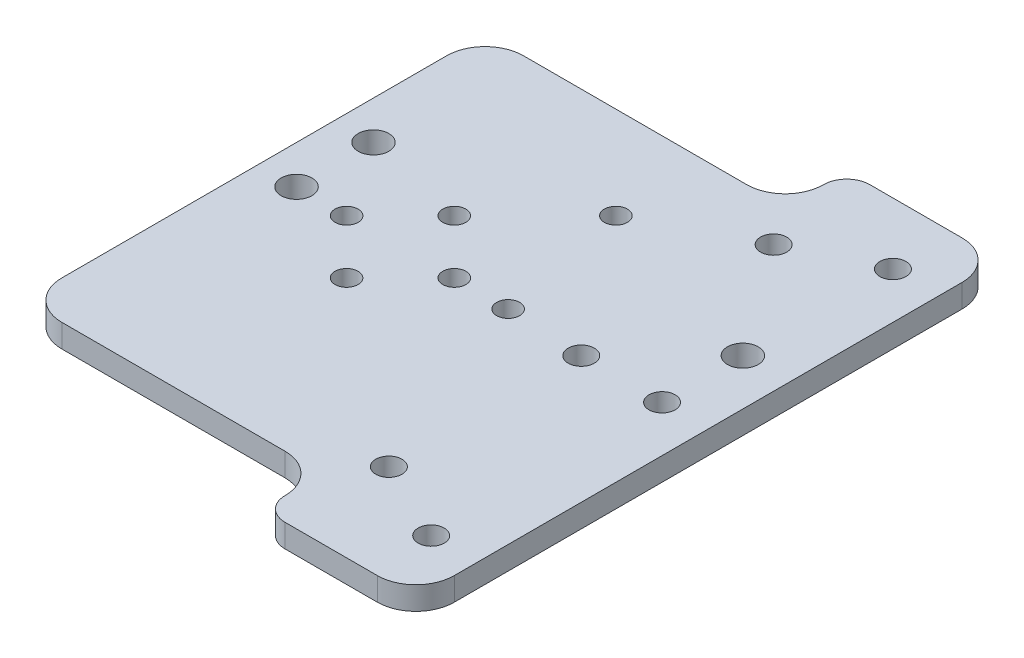
ISO-10303-21;
HEADER;
FILE_DESCRIPTION(('STEP AP214'),'2;1');
FILE_NAME('part.step','',(''),(''),'','','');
FILE_SCHEMA(('AUTOMOTIVE_DESIGN { 1 0 10303 214 1 1 1 1 }'));
ENDSEC;
DATA;
#1=APPLICATION_CONTEXT('core data for automotive mechanical design processes');
#2=APPLICATION_PROTOCOL_DEFINITION('international standard','automotive_design',2000,#1);
#3=PRODUCT_CONTEXT('',#1,'mechanical');
#4=PRODUCT('Part','Part','',(#3));
#5=PRODUCT_RELATED_PRODUCT_CATEGORY('part','',(#4));
#6=PRODUCT_DEFINITION_FORMATION('','',#4);
#7=PRODUCT_DEFINITION_CONTEXT('part definition',#1,'design');
#8=PRODUCT_DEFINITION('design','',#6,#7);
#9=PRODUCT_DEFINITION_SHAPE('','',#8);
#10=(LENGTH_UNIT() NAMED_UNIT(*) SI_UNIT(.MILLI.,.METRE.));
#11=(NAMED_UNIT(*) PLANE_ANGLE_UNIT() SI_UNIT($,.RADIAN.));
#12=(NAMED_UNIT(*) SI_UNIT($,.STERADIAN.) SOLID_ANGLE_UNIT());
#13=UNCERTAINTY_MEASURE_WITH_UNIT(LENGTH_MEASURE(1.E-05),#10,'distance_accuracy_value','');
#14=(GEOMETRIC_REPRESENTATION_CONTEXT(3) GLOBAL_UNCERTAINTY_ASSIGNED_CONTEXT((#13)) GLOBAL_UNIT_ASSIGNED_CONTEXT((#10,
#11,#12)) REPRESENTATION_CONTEXT('',''));
#15=CARTESIAN_POINT('',(0.,0.,0.));
#16=DIRECTION('',(0.,0.,1.));
#17=DIRECTION('',(1.,0.,0.));
#18=AXIS2_PLACEMENT_3D('',#15,#16,#17);
#19=CARTESIAN_POINT('',(0.,3.,0.));
#20=DIRECTION('',(0.,-1.,0.));
#21=DIRECTION('',(0.,0.,-1.));
#22=AXIS2_PLACEMENT_3D('',#19,#20,#21);
#23=PLANE('',#22);
#24=CARTESIAN_POINT('',(32.5,3.,-0.499999999999969));
#25=DIRECTION('',(0.,1.,0.));
#26=DIRECTION('',(0.,0.,1.));
#27=AXIS2_PLACEMENT_3D('',#24,#25,#26);
#28=CIRCLE('',#27,1.5);
#29=CARTESIAN_POINT('',(32.5,3.,1.00000000000004));
#30=VERTEX_POINT('',#29);
#31=EDGE_CURVE('E620',#30,#30,#28,.T.);
#32=ORIENTED_EDGE('',*,*,#31,.F.);
#33=EDGE_LOOP('',(#32));
#34=FACE_BOUND('',#33,.T.);
#35=CARTESIAN_POINT('',(53.,3.,30.));
#36=DIRECTION('',(0.,1.,0.));
#37=DIRECTION('',(0.,0.,1.));
#38=AXIS2_PLACEMENT_3D('',#35,#36,#37);
#39=CIRCLE('',#38,1.7);
#40=CARTESIAN_POINT('',(53.,3.,31.7));
#41=VERTEX_POINT('',#40);
#42=EDGE_CURVE('E636',#41,#41,#39,.T.);
#43=ORIENTED_EDGE('',*,*,#42,.F.);
#44=EDGE_LOOP('',(#43));
#45=FACE_BOUND('',#44,.T.);
#46=CARTESIAN_POINT('',(53.,3.,0.));
#47=DIRECTION('',(0.,1.,0.));
#48=DIRECTION('',(0.,0.,1.));
#49=AXIS2_PLACEMENT_3D('',#46,#47,#48);
#50=CIRCLE('',#49,1.7);
#51=CARTESIAN_POINT('',(53.,3.,1.7));
#52=VERTEX_POINT('',#51);
#53=EDGE_CURVE('E641',#52,#52,#50,.T.);
#54=ORIENTED_EDGE('',*,*,#53,.F.);
#55=EDGE_LOOP('',(#54));
#56=FACE_BOUND('',#55,.T.);
#57=CARTESIAN_POINT('',(53.,3.,-30.));
#58=DIRECTION('',(0.,1.,0.));
#59=DIRECTION('',(0.,0.,1.));
#60=AXIS2_PLACEMENT_3D('',#57,#58,#59);
#61=CIRCLE('',#60,1.7);
#62=CARTESIAN_POINT('',(53.,3.,-28.3));
#63=VERTEX_POINT('',#62);
#64=EDGE_CURVE('E591',#63,#63,#61,.T.);
#65=ORIENTED_EDGE('',*,*,#64,.F.);
#66=EDGE_LOOP('',(#65));
#67=FACE_BOUND('',#66,.T.);
#68=CARTESIAN_POINT('',(42.5,3.,0.));
#69=DIRECTION('',(0.,1.,0.));
#70=DIRECTION('',(0.,0.,1.));
#71=AXIS2_PLACEMENT_3D('',#68,#69,#70);
#72=CIRCLE('',#71,1.7);
#73=CARTESIAN_POINT('',(42.5,3.,1.7));
#74=VERTEX_POINT('',#73);
#75=EDGE_CURVE('E586',#74,#74,#72,.T.);
#76=ORIENTED_EDGE('',*,*,#75,.F.);
#77=EDGE_LOOP('',(#76));
#78=FACE_BOUND('',#77,.T.);
#79=CARTESIAN_POINT('',(42.5,3.,-25.));
#80=DIRECTION('',(0.,1.,0.));
#81=DIRECTION('',(0.,0.,1.));
#82=AXIS2_PLACEMENT_3D('',#79,#80,#81);
#83=CIRCLE('',#82,1.69999999999999);
#84=CARTESIAN_POINT('',(42.5,3.,-23.3));
#85=VERTEX_POINT('',#84);
#86=EDGE_CURVE('E311',#85,#85,#83,.T.);
#87=ORIENTED_EDGE('',*,*,#86,.F.);
#88=EDGE_LOOP('',(#87));
#89=FACE_BOUND('',#88,.T.);
#90=CARTESIAN_POINT('',(42.5,3.,25.));
#91=DIRECTION('',(0.,1.,0.));
#92=DIRECTION('',(0.,0.,1.));
#93=AXIS2_PLACEMENT_3D('',#90,#91,#92);
#94=CIRCLE('',#93,1.69999999999999);
#95=CARTESIAN_POINT('',(42.5,3.,26.7));
#96=VERTEX_POINT('',#95);
#97=EDGE_CURVE('E253',#96,#96,#94,.T.);
#98=ORIENTED_EDGE('',*,*,#97,.F.);
#99=EDGE_LOOP('',(#98));
#100=FACE_BOUND('',#99,.T.);
#101=CARTESIAN_POINT('',(34.,3.,35.));
#102=DIRECTION('',(0.,-1.,0.));
#103=DIRECTION('',(0.,0.,-1.));
#104=AXIS2_PLACEMENT_3D('',#101,#102,#103);
#105=CIRCLE('',#104,5.);
#106=CARTESIAN_POINT('',(34.,3.,30.));
#107=VERTEX_POINT('',#106);
#108=CARTESIAN_POINT('',(39.,3.,35.));
#109=VERTEX_POINT('',#108);
#110=EDGE_CURVE('E217',#107,#109,#105,.T.);
#111=ORIENTED_EDGE('',*,*,#110,.T.);
#112=CARTESIAN_POINT('',(42.,3.,35.));
#113=DIRECTION('',(0.,-1.,0.));
#114=DIRECTION('',(0.,0.,-1.));
#115=AXIS2_PLACEMENT_3D('',#112,#113,#114);
#116=CIRCLE('',#115,3.);
#117=CARTESIAN_POINT('',(42.,3.,38.));
#118=VERTEX_POINT('',#117);
#119=EDGE_CURVE('E42',#109,#118,#116,.F.);
#120=ORIENTED_EDGE('',*,*,#119,.T.);
#121=DIRECTION('',(1.,0.,0.));
#122=VECTOR('',#121,1.);
#123=CARTESIAN_POINT('',(59.,3.,38.));
#124=LINE('',#123,#122);
#125=CARTESIAN_POINT('',(54.,3.,38.));
#126=VERTEX_POINT('',#125);
#127=EDGE_CURVE('E172',#118,#126,#124,.T.);
#128=ORIENTED_EDGE('',*,*,#127,.T.);
#129=CARTESIAN_POINT('',(54.,3.,33.));
#130=DIRECTION('',(0.,-1.,0.));
#131=DIRECTION('',(0.,0.,-1.));
#132=AXIS2_PLACEMENT_3D('',#129,#130,#131);
#133=CIRCLE('',#132,5.);
#134=CARTESIAN_POINT('',(59.,3.,33.));
#135=VERTEX_POINT('',#134);
#136=EDGE_CURVE('E184',#126,#135,#133,.F.);
#137=ORIENTED_EDGE('',*,*,#136,.T.);
#138=DIRECTION('',(0.,0.,-1.));
#139=VECTOR('',#138,1.);
#140=CARTESIAN_POINT('',(59.,3.,-38.));
#141=LINE('',#140,#139);
#142=CARTESIAN_POINT('',(59.,3.,-33.));
#143=VERTEX_POINT('',#142);
#144=EDGE_CURVE('E166',#135,#143,#141,.T.);
#145=ORIENTED_EDGE('',*,*,#144,.T.);
#146=CARTESIAN_POINT('',(54.,3.,-33.));
#147=DIRECTION('',(0.,-1.,0.));
#148=DIRECTION('',(0.,0.,-1.));
#149=AXIS2_PLACEMENT_3D('',#146,#147,#148);
#150=CIRCLE('',#149,5.);
#151=CARTESIAN_POINT('',(54.,3.,-38.));
#152=VERTEX_POINT('',#151);
#153=EDGE_CURVE('E182',#143,#152,#150,.F.);
#154=ORIENTED_EDGE('',*,*,#153,.T.);
#155=DIRECTION('',(-1.,0.,0.));
#156=VECTOR('',#155,1.);
#157=CARTESIAN_POINT('',(39.,3.,-38.));
#158=LINE('',#157,#156);
#159=CARTESIAN_POINT('',(42.,3.,-38.));
#160=VERTEX_POINT('',#159);
#161=EDGE_CURVE('E321',#152,#160,#158,.T.);
#162=ORIENTED_EDGE('',*,*,#161,.T.);
#163=CARTESIAN_POINT('',(42.,3.,-35.));
#164=DIRECTION('',(0.,-1.,0.));
#165=DIRECTION('',(0.,0.,-1.));
#166=AXIS2_PLACEMENT_3D('',#163,#164,#165);
#167=CIRCLE('',#166,3.);
#168=CARTESIAN_POINT('',(39.,3.,-35.));
#169=VERTEX_POINT('',#168);
#170=EDGE_CURVE('E225',#160,#169,#167,.F.);
#171=ORIENTED_EDGE('',*,*,#170,.T.);
#172=CARTESIAN_POINT('',(34.,3.,-35.));
#173=DIRECTION('',(0.,-1.,0.));
#174=DIRECTION('',(0.,0.,-1.));
#175=AXIS2_PLACEMENT_3D('',#172,#173,#174);
#176=CIRCLE('',#175,5.);
#177=CARTESIAN_POINT('',(34.,3.,-30.));
#178=VERTEX_POINT('',#177);
#179=EDGE_CURVE('E214',#169,#178,#176,.T.);
#180=ORIENTED_EDGE('',*,*,#179,.T.);
#181=DIRECTION('',(-1.,0.,0.));
#182=VECTOR('',#181,1.);
#183=CARTESIAN_POINT('',(0.,3.,-30.));
#184=LINE('',#183,#182);
#185=CARTESIAN_POINT('',(5.,3.,-30.));
#186=VERTEX_POINT('',#185);
#187=EDGE_CURVE('E245',#178,#186,#184,.T.);
#188=ORIENTED_EDGE('',*,*,#187,.T.);
#189=CARTESIAN_POINT('',(5.,3.,-25.));
#190=DIRECTION('',(0.,-1.,0.));
#191=DIRECTION('',(0.,0.,-1.));
#192=AXIS2_PLACEMENT_3D('',#189,#190,#191);
#193=CIRCLE('',#192,5.);
#194=CARTESIAN_POINT('',(0.,3.,-25.));
#195=VERTEX_POINT('',#194);
#196=EDGE_CURVE('E186',#186,#195,#193,.F.);
#197=ORIENTED_EDGE('',*,*,#196,.T.);
#198=DIRECTION('',(0.,0.,1.));
#199=VECTOR('',#198,1.);
#200=CARTESIAN_POINT('',(0.,3.,0.));
#201=LINE('',#200,#199);
#202=CARTESIAN_POINT('',(0.,3.,25.));
#203=VERTEX_POINT('',#202);
#204=EDGE_CURVE('E243',#195,#203,#201,.T.);
#205=ORIENTED_EDGE('',*,*,#204,.T.);
#206=CARTESIAN_POINT('',(5.,3.,25.));
#207=DIRECTION('',(0.,-1.,0.));
#208=DIRECTION('',(0.,0.,-1.));
#209=AXIS2_PLACEMENT_3D('',#206,#207,#208);
#210=CIRCLE('',#209,5.);
#211=CARTESIAN_POINT('',(5.,3.,30.));
#212=VERTEX_POINT('',#211);
#213=EDGE_CURVE('E188',#203,#212,#210,.F.);
#214=ORIENTED_EDGE('',*,*,#213,.T.);
#215=DIRECTION('',(1.,0.,0.));
#216=VECTOR('',#215,1.);
#217=CARTESIAN_POINT('',(39.,3.,30.));
#218=LINE('',#217,#216);
#219=EDGE_CURVE('E154',#212,#107,#218,.T.);
#220=ORIENTED_EDGE('',*,*,#219,.T.);
#221=EDGE_LOOP('',(#111,#120,#128,#137,#145,#154,#162,#171,#180,#188,#197,#205,#214,#220));
#222=FACE_BOUND('',#221,.T.);
#223=CARTESIAN_POINT('',(5.,3.,-10.5));
#224=DIRECTION('',(0.,1.,0.));
#225=DIRECTION('',(0.,0.,1.));
#226=AXIS2_PLACEMENT_3D('',#223,#224,#225);
#227=CIRCLE('',#226,2.);
#228=CARTESIAN_POINT('',(5.,3.,-8.49999999999996));
#229=VERTEX_POINT('',#228);
#230=EDGE_CURVE('E632',#229,#229,#227,.F.);
#231=ORIENTED_EDGE('',*,*,#230,.T.);
#232=EDGE_LOOP('',(#231));
#233=FACE_BOUND('',#232,.T.);
#234=CARTESIAN_POINT('',(5.,3.,-0.499999999999963));
#235=DIRECTION('',(0.,1.,0.));
#236=DIRECTION('',(0.,0.,1.));
#237=AXIS2_PLACEMENT_3D('',#234,#235,#236);
#238=CIRCLE('',#237,2.);
#239=CARTESIAN_POINT('',(5.,3.,1.50000000000004));
#240=VERTEX_POINT('',#239);
#241=EDGE_CURVE('E661',#240,#240,#238,.F.);
#242=ORIENTED_EDGE('',*,*,#241,.T.);
#243=EDGE_LOOP('',(#242));
#244=FACE_BOUND('',#243,.T.);
#245=CARTESIAN_POINT('',(11.5,3.,-0.499999999999965));
#246=DIRECTION('',(0.,1.,0.));
#247=DIRECTION('',(0.,0.,1.));
#248=AXIS2_PLACEMENT_3D('',#245,#246,#247);
#249=CIRCLE('',#248,1.5);
#250=CARTESIAN_POINT('',(11.5,3.,1.00000000000004));
#251=VERTEX_POINT('',#250);
#252=EDGE_CURVE('E670',#251,#251,#249,.F.);
#253=ORIENTED_EDGE('',*,*,#252,.T.);
#254=EDGE_LOOP('',(#253));
#255=FACE_BOUND('',#254,.T.);
#256=CARTESIAN_POINT('',(18.5,3.,-7.49999999999997));
#257=DIRECTION('',(0.,1.,0.));
#258=DIRECTION('',(0.,0.,1.));
#259=AXIS2_PLACEMENT_3D('',#256,#257,#258);
#260=CIRCLE('',#259,1.5);
#261=CARTESIAN_POINT('',(18.5,3.,-5.99999999999996));
#262=VERTEX_POINT('',#261);
#263=EDGE_CURVE('E676',#262,#262,#260,.F.);
#264=ORIENTED_EDGE('',*,*,#263,.T.);
#265=EDGE_LOOP('',(#264));
#266=FACE_BOUND('',#265,.T.);
#267=CARTESIAN_POINT('',(18.5,3.,6.50000000000003));
#268=DIRECTION('',(0.,1.,0.));
#269=DIRECTION('',(0.,0.,1.));
#270=AXIS2_PLACEMENT_3D('',#267,#268,#269);
#271=CIRCLE('',#270,1.5);
#272=CARTESIAN_POINT('',(18.5,3.,8.00000000000004));
#273=VERTEX_POINT('',#272);
#274=EDGE_CURVE('E682',#273,#273,#271,.F.);
#275=ORIENTED_EDGE('',*,*,#274,.T.);
#276=EDGE_LOOP('',(#275));
#277=FACE_BOUND('',#276,.T.);
#278=CARTESIAN_POINT('',(25.5,3.,-0.499999999999969));
#279=DIRECTION('',(0.,1.,0.));
#280=DIRECTION('',(0.,0.,1.));
#281=AXIS2_PLACEMENT_3D('',#278,#279,#280);
#282=CIRCLE('',#281,1.5);
#283=CARTESIAN_POINT('',(25.5,3.,1.00000000000004));
#284=VERTEX_POINT('',#283);
#285=EDGE_CURVE('E688',#284,#284,#282,.F.);
#286=ORIENTED_EDGE('',*,*,#285,.T.);
#287=EDGE_LOOP('',(#286));
#288=FACE_BOUND('',#287,.T.);
#289=CARTESIAN_POINT('',(29.,3.,-18.));
#290=DIRECTION('',(0.,1.,0.));
#291=DIRECTION('',(0.,0.,1.));
#292=AXIS2_PLACEMENT_3D('',#289,#290,#291);
#293=CIRCLE('',#292,1.5);
#294=CARTESIAN_POINT('',(29.,3.,-16.5));
#295=VERTEX_POINT('',#294);
#296=EDGE_CURVE('E692',#295,#295,#293,.T.);
#297=ORIENTED_EDGE('',*,*,#296,.F.);
#298=EDGE_LOOP('',(#297));
#299=FACE_BOUND('',#298,.T.);
#300=CARTESIAN_POINT('',(53.,3.,-10.5));
#301=DIRECTION('',(0.,1.,0.));
#302=DIRECTION('',(0.,0.,1.));
#303=AXIS2_PLACEMENT_3D('',#300,#301,#302);
#304=CIRCLE('',#303,2.);
#305=CARTESIAN_POINT('',(53.,3.,-8.49999999999996));
#306=VERTEX_POINT('',#305);
#307=EDGE_CURVE('E621',#306,#306,#304,.T.);
#308=ORIENTED_EDGE('',*,*,#307,.F.);
#309=EDGE_LOOP('',(#308));
#310=FACE_BOUND('',#309,.T.);
#311=ADVANCED_FACE('F34',(#34,#45,#56,#67,#78,#89,#100,#222,#233,#244,#255,#266,#277,#288,#299,
#310),#23,.F.);
#312=CARTESIAN_POINT('',(0.,0.,0.));
#313=DIRECTION('',(0.,-1.,0.));
#314=DIRECTION('',(0.,0.,-1.));
#315=AXIS2_PLACEMENT_3D('',#312,#313,#314);
#316=PLANE('',#315);
#317=CARTESIAN_POINT('',(25.5,0.,-0.499999999999969));
#318=DIRECTION('',(0.,1.,0.));
#319=DIRECTION('',(0.,0.,1.));
#320=AXIS2_PLACEMENT_3D('',#317,#318,#319);
#321=CIRCLE('',#320,1.5);
#322=CARTESIAN_POINT('',(25.5,0.,1.00000000000004));
#323=VERTEX_POINT('',#322);
#324=EDGE_CURVE('E685',#323,#323,#321,.F.);
#325=ORIENTED_EDGE('',*,*,#324,.F.);
#326=EDGE_LOOP('',(#325));
#327=FACE_BOUND('',#326,.T.);
#328=CARTESIAN_POINT('',(18.5,0.,6.50000000000003));
#329=DIRECTION('',(0.,1.,0.));
#330=DIRECTION('',(0.,0.,1.));
#331=AXIS2_PLACEMENT_3D('',#328,#329,#330);
#332=CIRCLE('',#331,1.5);
#333=CARTESIAN_POINT('',(18.5,0.,8.00000000000004));
#334=VERTEX_POINT('',#333);
#335=EDGE_CURVE('E679',#334,#334,#332,.F.);
#336=ORIENTED_EDGE('',*,*,#335,.F.);
#337=EDGE_LOOP('',(#336));
#338=FACE_BOUND('',#337,.T.);
#339=CARTESIAN_POINT('',(18.5,0.,-7.49999999999997));
#340=DIRECTION('',(0.,1.,0.));
#341=DIRECTION('',(0.,0.,1.));
#342=AXIS2_PLACEMENT_3D('',#339,#340,#341);
#343=CIRCLE('',#342,1.5);
#344=CARTESIAN_POINT('',(18.5,0.,-5.99999999999996));
#345=VERTEX_POINT('',#344);
#346=EDGE_CURVE('E673',#345,#345,#343,.F.);
#347=ORIENTED_EDGE('',*,*,#346,.F.);
#348=EDGE_LOOP('',(#347));
#349=FACE_BOUND('',#348,.T.);
#350=CARTESIAN_POINT('',(11.5,0.,-0.499999999999965));
#351=DIRECTION('',(0.,1.,0.));
#352=DIRECTION('',(0.,0.,1.));
#353=AXIS2_PLACEMENT_3D('',#350,#351,#352);
#354=CIRCLE('',#353,1.5);
#355=CARTESIAN_POINT('',(11.5,0.,1.00000000000004));
#356=VERTEX_POINT('',#355);
#357=EDGE_CURVE('E665',#356,#356,#354,.F.);
#358=ORIENTED_EDGE('',*,*,#357,.F.);
#359=EDGE_LOOP('',(#358));
#360=FACE_BOUND('',#359,.T.);
#361=CARTESIAN_POINT('',(5.,0.,-0.499999999999963));
#362=DIRECTION('',(0.,1.,0.));
#363=DIRECTION('',(0.,0.,1.));
#364=AXIS2_PLACEMENT_3D('',#361,#362,#363);
#365=CIRCLE('',#364,2.);
#366=CARTESIAN_POINT('',(5.,0.,1.50000000000004));
#367=VERTEX_POINT('',#366);
#368=EDGE_CURVE('E635',#367,#367,#365,.F.);
#369=ORIENTED_EDGE('',*,*,#368,.F.);
#370=EDGE_LOOP('',(#369));
#371=FACE_BOUND('',#370,.T.);
#372=CARTESIAN_POINT('',(5.,0.,-10.5));
#373=DIRECTION('',(0.,1.,0.));
#374=DIRECTION('',(0.,0.,1.));
#375=AXIS2_PLACEMENT_3D('',#372,#373,#374);
#376=CIRCLE('',#375,2.);
#377=CARTESIAN_POINT('',(5.,0.,-8.49999999999996));
#378=VERTEX_POINT('',#377);
#379=EDGE_CURVE('E629',#378,#378,#376,.F.);
#380=ORIENTED_EDGE('',*,*,#379,.F.);
#381=EDGE_LOOP('',(#380));
#382=FACE_BOUND('',#381,.T.);
#383=CARTESIAN_POINT('',(53.,0.,0.));
#384=DIRECTION('',(0.,1.,0.));
#385=DIRECTION('',(0.,0.,1.));
#386=AXIS2_PLACEMENT_3D('',#383,#384,#385);
#387=CIRCLE('',#386,1.7);
#388=CARTESIAN_POINT('',(53.,0.,1.7));
#389=VERTEX_POINT('',#388);
#390=EDGE_CURVE('E639',#389,#389,#387,.T.);
#391=ORIENTED_EDGE('',*,*,#390,.T.);
#392=EDGE_LOOP('',(#391));
#393=FACE_BOUND('',#392,.T.);
#394=CARTESIAN_POINT('',(42.5,0.,0.));
#395=DIRECTION('',(0.,1.,0.));
#396=DIRECTION('',(0.,0.,1.));
#397=AXIS2_PLACEMENT_3D('',#394,#395,#396);
#398=CIRCLE('',#397,1.7);
#399=CARTESIAN_POINT('',(42.5,0.,1.7));
#400=VERTEX_POINT('',#399);
#401=EDGE_CURVE('E589',#400,#400,#398,.T.);
#402=ORIENTED_EDGE('',*,*,#401,.T.);
#403=EDGE_LOOP('',(#402));
#404=FACE_BOUND('',#403,.T.);
#405=CARTESIAN_POINT('',(42.5,0.,25.));
#406=DIRECTION('',(0.,1.,0.));
#407=DIRECTION('',(0.,0.,1.));
#408=AXIS2_PLACEMENT_3D('',#405,#406,#407);
#409=CIRCLE('',#408,1.69999999999999);
#410=CARTESIAN_POINT('',(42.5,0.,26.7));
#411=VERTEX_POINT('',#410);
#412=EDGE_CURVE('E309',#411,#411,#409,.T.);
#413=ORIENTED_EDGE('',*,*,#412,.T.);
#414=EDGE_LOOP('',(#413));
#415=FACE_BOUND('',#414,.T.);
#416=DIRECTION('',(1.,0.,0.));
#417=VECTOR('',#416,1.);
#418=CARTESIAN_POINT('',(59.,0.,38.));
#419=LINE('',#418,#417);
#420=CARTESIAN_POINT('',(42.,0.,38.));
#421=VERTEX_POINT('',#420);
#422=CARTESIAN_POINT('',(54.,0.,38.));
#423=VERTEX_POINT('',#422);
#424=EDGE_CURVE('E163',#421,#423,#419,.T.);
#425=ORIENTED_EDGE('',*,*,#424,.F.);
#426=CARTESIAN_POINT('',(42.,0.,35.));
#427=DIRECTION('',(0.,-1.,0.));
#428=DIRECTION('',(0.,0.,-1.));
#429=AXIS2_PLACEMENT_3D('',#426,#427,#428);
#430=CIRCLE('',#429,3.);
#431=CARTESIAN_POINT('',(39.,0.,35.));
#432=VERTEX_POINT('',#431);
#433=EDGE_CURVE('E223',#421,#432,#430,.T.);
#434=ORIENTED_EDGE('',*,*,#433,.T.);
#435=CARTESIAN_POINT('',(34.,0.,35.));
#436=DIRECTION('',(0.,-1.,0.));
#437=DIRECTION('',(0.,0.,-1.));
#438=AXIS2_PLACEMENT_3D('',#435,#436,#437);
#439=CIRCLE('',#438,5.);
#440=CARTESIAN_POINT('',(34.,0.,30.));
#441=VERTEX_POINT('',#440);
#442=EDGE_CURVE('E162',#432,#441,#439,.F.);
#443=ORIENTED_EDGE('',*,*,#442,.T.);
#444=DIRECTION('',(1.,0.,0.));
#445=VECTOR('',#444,1.);
#446=CARTESIAN_POINT('',(39.,0.,30.));
#447=LINE('',#446,#445);
#448=CARTESIAN_POINT('',(5.,0.,30.));
#449=VERTEX_POINT('',#448);
#450=EDGE_CURVE('E151',#449,#441,#447,.T.);
#451=ORIENTED_EDGE('',*,*,#450,.F.);
#452=CARTESIAN_POINT('',(5.,0.,25.));
#453=DIRECTION('',(0.,-1.,0.));
#454=DIRECTION('',(0.,0.,-1.));
#455=AXIS2_PLACEMENT_3D('',#452,#453,#454);
#456=CIRCLE('',#455,5.);
#457=CARTESIAN_POINT('',(0.,0.,25.));
#458=VERTEX_POINT('',#457);
#459=EDGE_CURVE('E135',#449,#458,#456,.T.);
#460=ORIENTED_EDGE('',*,*,#459,.T.);
#461=DIRECTION('',(0.,0.,1.));
#462=VECTOR('',#461,1.);
#463=CARTESIAN_POINT('',(0.,0.,30.));
#464=LINE('',#463,#462);
#465=CARTESIAN_POINT('',(0.,0.,-25.));
#466=VERTEX_POINT('',#465);
#467=EDGE_CURVE('E164',#466,#458,#464,.T.);
#468=ORIENTED_EDGE('',*,*,#467,.F.);
#469=CARTESIAN_POINT('',(5.,0.,-25.));
#470=DIRECTION('',(0.,-1.,0.));
#471=DIRECTION('',(0.,0.,-1.));
#472=AXIS2_PLACEMENT_3D('',#469,#470,#471);
#473=CIRCLE('',#472,5.);
#474=CARTESIAN_POINT('',(5.,0.,-30.));
#475=VERTEX_POINT('',#474);
#476=EDGE_CURVE('E145',#466,#475,#473,.T.);
#477=ORIENTED_EDGE('',*,*,#476,.T.);
#478=DIRECTION('',(-1.,0.,0.));
#479=VECTOR('',#478,1.);
#480=CARTESIAN_POINT('',(0.,0.,-30.));
#481=LINE('',#480,#479);
#482=CARTESIAN_POINT('',(34.,0.,-30.));
#483=VERTEX_POINT('',#482);
#484=EDGE_CURVE('E168',#483,#475,#481,.T.);
#485=ORIENTED_EDGE('',*,*,#484,.F.);
#486=CARTESIAN_POINT('',(34.,0.,-35.));
#487=DIRECTION('',(0.,-1.,0.));
#488=DIRECTION('',(0.,0.,-1.));
#489=AXIS2_PLACEMENT_3D('',#486,#487,#488);
#490=CIRCLE('',#489,5.);
#491=CARTESIAN_POINT('',(39.,0.,-35.));
#492=VERTEX_POINT('',#491);
#493=EDGE_CURVE('E212',#483,#492,#490,.F.);
#494=ORIENTED_EDGE('',*,*,#493,.T.);
#495=CARTESIAN_POINT('',(42.,0.,-35.));
#496=DIRECTION('',(0.,-1.,0.));
#497=DIRECTION('',(0.,0.,-1.));
#498=AXIS2_PLACEMENT_3D('',#495,#496,#497);
#499=CIRCLE('',#498,3.);
#500=CARTESIAN_POINT('',(42.,0.,-38.));
#501=VERTEX_POINT('',#500);
#502=EDGE_CURVE('E55',#492,#501,#499,.T.);
#503=ORIENTED_EDGE('',*,*,#502,.T.);
#504=DIRECTION('',(-1.,0.,0.));
#505=VECTOR('',#504,1.);
#506=CARTESIAN_POINT('',(39.,0.,-38.));
#507=LINE('',#506,#505);
#508=CARTESIAN_POINT('',(54.,0.,-38.));
#509=VERTEX_POINT('',#508);
#510=EDGE_CURVE('E252',#509,#501,#507,.T.);
#511=ORIENTED_EDGE('',*,*,#510,.F.);
#512=CARTESIAN_POINT('',(54.,0.,-33.));
#513=DIRECTION('',(0.,-1.,0.));
#514=DIRECTION('',(0.,0.,-1.));
#515=AXIS2_PLACEMENT_3D('',#512,#513,#514);
#516=CIRCLE('',#515,5.);
#517=CARTESIAN_POINT('',(59.,0.,-33.));
#518=VERTEX_POINT('',#517);
#519=EDGE_CURVE('E155',#509,#518,#516,.T.);
#520=ORIENTED_EDGE('',*,*,#519,.T.);
#521=DIRECTION('',(0.,0.,-1.));
#522=VECTOR('',#521,1.);
#523=CARTESIAN_POINT('',(59.,0.,-38.));
#524=LINE('',#523,#522);
#525=CARTESIAN_POINT('',(59.,0.,33.));
#526=VERTEX_POINT('',#525);
#527=EDGE_CURVE('E249',#526,#518,#524,.T.);
#528=ORIENTED_EDGE('',*,*,#527,.F.);
#529=CARTESIAN_POINT('',(54.,0.,33.));
#530=DIRECTION('',(0.,-1.,0.));
#531=DIRECTION('',(0.,0.,-1.));
#532=AXIS2_PLACEMENT_3D('',#529,#530,#531);
#533=CIRCLE('',#532,5.);
#534=EDGE_CURVE('E175',#526,#423,#533,.T.);
#535=ORIENTED_EDGE('',*,*,#534,.T.);
#536=EDGE_LOOP('',(#425,#434,#443,#451,#460,#468,#477,#485,#494,#503,#511,#520,#528,#535));
#537=FACE_BOUND('',#536,.T.);
#538=CARTESIAN_POINT('',(42.5,0.,-25.));
#539=DIRECTION('',(0.,1.,0.));
#540=DIRECTION('',(0.,0.,1.));
#541=AXIS2_PLACEMENT_3D('',#538,#539,#540);
#542=CIRCLE('',#541,1.69999999999999);
#543=CARTESIAN_POINT('',(42.5,0.,-23.3));
#544=VERTEX_POINT('',#543);
#545=EDGE_CURVE('E315',#544,#544,#542,.T.);
#546=ORIENTED_EDGE('',*,*,#545,.T.);
#547=EDGE_LOOP('',(#546));
#548=FACE_BOUND('',#547,.T.);
#549=CARTESIAN_POINT('',(53.,0.,-30.));
#550=DIRECTION('',(0.,1.,0.));
#551=DIRECTION('',(0.,0.,1.));
#552=AXIS2_PLACEMENT_3D('',#549,#550,#551);
#553=CIRCLE('',#552,1.7);
#554=CARTESIAN_POINT('',(53.,0.,-28.3));
#555=VERTEX_POINT('',#554);
#556=EDGE_CURVE('E595',#555,#555,#553,.T.);
#557=ORIENTED_EDGE('',*,*,#556,.T.);
#558=EDGE_LOOP('',(#557));
#559=FACE_BOUND('',#558,.T.);
#560=CARTESIAN_POINT('',(53.,0.,30.));
#561=DIRECTION('',(0.,1.,0.));
#562=DIRECTION('',(0.,0.,1.));
#563=AXIS2_PLACEMENT_3D('',#560,#561,#562);
#564=CIRCLE('',#563,1.7);
#565=CARTESIAN_POINT('',(53.,0.,31.7));
#566=VERTEX_POINT('',#565);
#567=EDGE_CURVE('E608',#566,#566,#564,.T.);
#568=ORIENTED_EDGE('',*,*,#567,.T.);
#569=EDGE_LOOP('',(#568));
#570=FACE_BOUND('',#569,.T.);
#571=CARTESIAN_POINT('',(29.,0.,-18.));
#572=DIRECTION('',(0.,1.,0.));
#573=DIRECTION('',(0.,0.,1.));
#574=AXIS2_PLACEMENT_3D('',#571,#572,#573);
#575=CIRCLE('',#574,1.5);
#576=CARTESIAN_POINT('',(29.,0.,-16.5));
#577=VERTEX_POINT('',#576);
#578=EDGE_CURVE('E612',#577,#577,#575,.T.);
#579=ORIENTED_EDGE('',*,*,#578,.T.);
#580=EDGE_LOOP('',(#579));
#581=FACE_BOUND('',#580,.T.);
#582=CARTESIAN_POINT('',(32.5,0.,-0.499999999999969));
#583=DIRECTION('',(0.,1.,0.));
#584=DIRECTION('',(0.,0.,1.));
#585=AXIS2_PLACEMENT_3D('',#582,#583,#584);
#586=CIRCLE('',#585,1.5);
#587=CARTESIAN_POINT('',(32.5,0.,1.00000000000004));
#588=VERTEX_POINT('',#587);
#589=EDGE_CURVE('E616',#588,#588,#586,.T.);
#590=ORIENTED_EDGE('',*,*,#589,.T.);
#591=EDGE_LOOP('',(#590));
#592=FACE_BOUND('',#591,.T.);
#593=CARTESIAN_POINT('',(53.,0.,-10.5));
#594=DIRECTION('',(0.,1.,0.));
#595=DIRECTION('',(0.,0.,1.));
#596=AXIS2_PLACEMENT_3D('',#593,#594,#595);
#597=CIRCLE('',#596,2.);
#598=CARTESIAN_POINT('',(53.,0.,-8.49999999999996));
#599=VERTEX_POINT('',#598);
#600=EDGE_CURVE('E619',#599,#599,#597,.T.);
#601=ORIENTED_EDGE('',*,*,#600,.T.);
#602=EDGE_LOOP('',(#601));
#603=FACE_BOUND('',#602,.T.);
#604=ADVANCED_FACE('F159',(#327,#338,#349,#360,#371,#382,#393,#404,#415,#537,#548,#559,#570,
#581,#592,#603),#316,.T.);
#605=CARTESIAN_POINT('',(59.,3.,-38.));
#606=DIRECTION('',(-1.,0.,0.));
#607=DIRECTION('',(0.,0.,1.));
#608=AXIS2_PLACEMENT_3D('',#605,#606,#607);
#609=PLANE('',#608);
#610=ORIENTED_EDGE('',*,*,#144,.F.);
#611=DIRECTION('',(0.,-1.,0.));
#612=VECTOR('',#611,1.);
#613=CARTESIAN_POINT('',(59.,3.,33.));
#614=LINE('',#613,#612);
#615=EDGE_CURVE('E203',#135,#526,#614,.T.);
#616=ORIENTED_EDGE('',*,*,#615,.T.);
#617=ORIENTED_EDGE('',*,*,#527,.T.);
#618=DIRECTION('',(0.,-1.,0.));
#619=VECTOR('',#618,1.);
#620=CARTESIAN_POINT('',(59.,3.,-33.));
#621=LINE('',#620,#619);
#622=EDGE_CURVE('E201',#518,#143,#621,.F.);
#623=ORIENTED_EDGE('',*,*,#622,.T.);
#624=EDGE_LOOP('',(#610,#616,#617,#623));
#625=FACE_BOUND('',#624,.T.);
#626=ADVANCED_FACE('F284',(#625),#609,.F.);
#627=CARTESIAN_POINT('',(39.,3.,-38.));
#628=DIRECTION('',(0.,0.,1.));
#629=DIRECTION('',(1.,0.,0.));
#630=AXIS2_PLACEMENT_3D('',#627,#628,#629);
#631=PLANE('',#630);
#632=ORIENTED_EDGE('',*,*,#510,.T.);
#633=DIRECTION('',(0.,-1.,0.));
#634=VECTOR('',#633,1.);
#635=CARTESIAN_POINT('',(42.,3.,-38.));
#636=LINE('',#635,#634);
#637=EDGE_CURVE('E11',#501,#160,#636,.F.);
#638=ORIENTED_EDGE('',*,*,#637,.T.);
#639=ORIENTED_EDGE('',*,*,#161,.F.);
#640=DIRECTION('',(0.,-1.,0.));
#641=VECTOR('',#640,1.);
#642=CARTESIAN_POINT('',(54.,3.,-38.));
#643=LINE('',#642,#641);
#644=EDGE_CURVE('E209',#152,#509,#643,.T.);
#645=ORIENTED_EDGE('',*,*,#644,.T.);
#646=EDGE_LOOP('',(#632,#638,#639,#645));
#647=FACE_BOUND('',#646,.T.);
#648=ADVANCED_FACE('F276',(#647),#631,.F.);
#649=CARTESIAN_POINT('',(0.,3.,-30.));
#650=DIRECTION('',(0.,0.,1.));
#651=DIRECTION('',(1.,0.,0.));
#652=AXIS2_PLACEMENT_3D('',#649,#650,#651);
#653=PLANE('',#652);
#654=ORIENTED_EDGE('',*,*,#484,.T.);
#655=DIRECTION('',(0.,-1.,0.));
#656=VECTOR('',#655,1.);
#657=CARTESIAN_POINT('',(5.,3.,-30.));
#658=LINE('',#657,#656);
#659=EDGE_CURVE('E193',#475,#186,#658,.F.);
#660=ORIENTED_EDGE('',*,*,#659,.T.);
#661=ORIENTED_EDGE('',*,*,#187,.F.);
#662=DIRECTION('',(0.,-1.,0.));
#663=VECTOR('',#662,1.);
#664=CARTESIAN_POINT('',(34.,0.,-30.));
#665=LINE('',#664,#663);
#666=EDGE_CURVE('E190',#178,#483,#665,.T.);
#667=ORIENTED_EDGE('',*,*,#666,.T.);
#668=EDGE_LOOP('',(#654,#660,#661,#667));
#669=FACE_BOUND('',#668,.T.);
#670=ADVANCED_FACE('F258',(#669),#653,.F.);
#671=CARTESIAN_POINT('',(0.,3.,30.));
#672=DIRECTION('',(1.,0.,0.));
#673=DIRECTION('',(0.,0.,-1.));
#674=AXIS2_PLACEMENT_3D('',#671,#672,#673);
#675=PLANE('',#674);
#676=ORIENTED_EDGE('',*,*,#467,.T.);
#677=DIRECTION('',(0.,-1.,0.));
#678=VECTOR('',#677,1.);
#679=CARTESIAN_POINT('',(0.,3.,25.));
#680=LINE('',#679,#678);
#681=EDGE_CURVE('E140',#458,#203,#680,.F.);
#682=ORIENTED_EDGE('',*,*,#681,.T.);
#683=ORIENTED_EDGE('',*,*,#204,.F.);
#684=DIRECTION('',(0.,-1.,0.));
#685=VECTOR('',#684,1.);
#686=CARTESIAN_POINT('',(0.,3.,-25.));
#687=LINE('',#686,#685);
#688=EDGE_CURVE('E144',#195,#466,#687,.T.);
#689=ORIENTED_EDGE('',*,*,#688,.T.);
#690=EDGE_LOOP('',(#676,#682,#683,#689));
#691=FACE_BOUND('',#690,.T.);
#692=ADVANCED_FACE('F268',(#691),#675,.F.);
#693=CARTESIAN_POINT('',(39.,3.,30.));
#694=DIRECTION('',(0.,0.,-1.));
#695=DIRECTION('',(-1.,0.,0.));
#696=AXIS2_PLACEMENT_3D('',#693,#694,#695);
#697=PLANE('',#696);
#698=ORIENTED_EDGE('',*,*,#219,.F.);
#699=DIRECTION('',(0.,-1.,0.));
#700=VECTOR('',#699,1.);
#701=CARTESIAN_POINT('',(5.,3.,30.));
#702=LINE('',#701,#700);
#703=EDGE_CURVE('E139',#212,#449,#702,.T.);
#704=ORIENTED_EDGE('',*,*,#703,.T.);
#705=ORIENTED_EDGE('',*,*,#450,.T.);
#706=DIRECTION('',(0.,-1.,0.));
#707=VECTOR('',#706,1.);
#708=CARTESIAN_POINT('',(34.,3.,30.));
#709=LINE('',#708,#707);
#710=EDGE_CURVE('E156',#441,#107,#709,.F.);
#711=ORIENTED_EDGE('',*,*,#710,.T.);
#712=EDGE_LOOP('',(#698,#704,#705,#711));
#713=FACE_BOUND('',#712,.T.);
#714=ADVANCED_FACE('F150',(#713),#697,.F.);
#715=CARTESIAN_POINT('',(59.,3.,38.));
#716=DIRECTION('',(0.,0.,-1.));
#717=DIRECTION('',(-1.,0.,0.));
#718=AXIS2_PLACEMENT_3D('',#715,#716,#717);
#719=PLANE('',#718);
#720=ORIENTED_EDGE('',*,*,#127,.F.);
#721=DIRECTION('',(0.,-1.,0.));
#722=VECTOR('',#721,1.);
#723=CARTESIAN_POINT('',(42.,3.,38.));
#724=LINE('',#723,#722);
#725=EDGE_CURVE('E219',#118,#421,#724,.T.);
#726=ORIENTED_EDGE('',*,*,#725,.T.);
#727=ORIENTED_EDGE('',*,*,#424,.T.);
#728=DIRECTION('',(0.,-1.,0.));
#729=VECTOR('',#728,1.);
#730=CARTESIAN_POINT('',(54.,3.,38.));
#731=LINE('',#730,#729);
#732=EDGE_CURVE('E206',#423,#126,#731,.F.);
#733=ORIENTED_EDGE('',*,*,#732,.T.);
#734=EDGE_LOOP('',(#720,#726,#727,#733));
#735=FACE_BOUND('',#734,.T.);
#736=ADVANCED_FACE('F235',(#735),#719,.F.);
#737=CARTESIAN_POINT('',(42.5,3.,25.));
#738=DIRECTION('',(0.,-1.,0.));
#739=DIRECTION('',(0.,0.,-1.));
#740=AXIS2_PLACEMENT_3D('',#737,#738,#739);
#741=CYLINDRICAL_SURFACE('',#740,1.69999999999999);
#742=ORIENTED_EDGE('',*,*,#97,.T.);
#743=EDGE_LOOP('',(#742));
#744=FACE_BOUND('',#743,.T.);
#745=ORIENTED_EDGE('',*,*,#412,.F.);
#746=EDGE_LOOP('',(#745));
#747=FACE_BOUND('',#746,.T.);
#748=ADVANCED_FACE('F290',(#744,#747),#741,.F.);
#749=CARTESIAN_POINT('',(42.5,3.,-25.));
#750=DIRECTION('',(0.,-1.,0.));
#751=DIRECTION('',(0.,0.,-1.));
#752=AXIS2_PLACEMENT_3D('',#749,#750,#751);
#753=CYLINDRICAL_SURFACE('',#752,1.69999999999999);
#754=ORIENTED_EDGE('',*,*,#86,.T.);
#755=EDGE_LOOP('',(#754));
#756=FACE_BOUND('',#755,.T.);
#757=ORIENTED_EDGE('',*,*,#545,.F.);
#758=EDGE_LOOP('',(#757));
#759=FACE_BOUND('',#758,.T.);
#760=ADVANCED_FACE('F297',(#756,#759),#753,.F.);
#761=CARTESIAN_POINT('',(42.5,3.,0.));
#762=DIRECTION('',(0.,-1.,0.));
#763=DIRECTION('',(0.,0.,-1.));
#764=AXIS2_PLACEMENT_3D('',#761,#762,#763);
#765=CYLINDRICAL_SURFACE('',#764,1.7);
#766=ORIENTED_EDGE('',*,*,#75,.T.);
#767=EDGE_LOOP('',(#766));
#768=FACE_BOUND('',#767,.T.);
#769=ORIENTED_EDGE('',*,*,#401,.F.);
#770=EDGE_LOOP('',(#769));
#771=FACE_BOUND('',#770,.T.);
#772=ADVANCED_FACE('F302',(#768,#771),#765,.F.);
#773=CARTESIAN_POINT('',(53.,3.,-30.));
#774=DIRECTION('',(0.,-1.,0.));
#775=DIRECTION('',(0.,0.,-1.));
#776=AXIS2_PLACEMENT_3D('',#773,#774,#775);
#777=CYLINDRICAL_SURFACE('',#776,1.7);
#778=ORIENTED_EDGE('',*,*,#64,.T.);
#779=EDGE_LOOP('',(#778));
#780=FACE_BOUND('',#779,.T.);
#781=ORIENTED_EDGE('',*,*,#556,.F.);
#782=EDGE_LOOP('',(#781));
#783=FACE_BOUND('',#782,.T.);
#784=ADVANCED_FACE('F551',(#780,#783),#777,.F.);
#785=CARTESIAN_POINT('',(53.,3.,0.));
#786=DIRECTION('',(0.,-1.,0.));
#787=DIRECTION('',(0.,0.,-1.));
#788=AXIS2_PLACEMENT_3D('',#785,#786,#787);
#789=CYLINDRICAL_SURFACE('',#788,1.7);
#790=ORIENTED_EDGE('',*,*,#53,.T.);
#791=EDGE_LOOP('',(#790));
#792=FACE_BOUND('',#791,.T.);
#793=ORIENTED_EDGE('',*,*,#390,.F.);
#794=EDGE_LOOP('',(#793));
#795=FACE_BOUND('',#794,.T.);
#796=ADVANCED_FACE('F541',(#792,#795),#789,.F.);
#797=CARTESIAN_POINT('',(53.,3.,30.));
#798=DIRECTION('',(0.,-1.,0.));
#799=DIRECTION('',(0.,0.,-1.));
#800=AXIS2_PLACEMENT_3D('',#797,#798,#799);
#801=CYLINDRICAL_SURFACE('',#800,1.7);
#802=ORIENTED_EDGE('',*,*,#42,.T.);
#803=EDGE_LOOP('',(#802));
#804=FACE_BOUND('',#803,.T.);
#805=ORIENTED_EDGE('',*,*,#567,.F.);
#806=EDGE_LOOP('',(#805));
#807=FACE_BOUND('',#806,.T.);
#808=ADVANCED_FACE('F532',(#804,#807),#801,.F.);
#809=CARTESIAN_POINT('',(5.,0.,-10.5));
#810=DIRECTION('',(0.,1.,0.));
#811=DIRECTION('',(0.,0.,1.));
#812=AXIS2_PLACEMENT_3D('',#809,#810,#811);
#813=CYLINDRICAL_SURFACE('',#812,2.);
#814=ORIENTED_EDGE('',*,*,#379,.T.);
#815=EDGE_LOOP('',(#814));
#816=FACE_BOUND('',#815,.T.);
#817=ORIENTED_EDGE('',*,*,#230,.F.);
#818=EDGE_LOOP('',(#817));
#819=FACE_BOUND('',#818,.T.);
#820=ADVANCED_FACE('F523',(#816,#819),#813,.F.);
#821=CARTESIAN_POINT('',(5.,0.,-0.499999999999963));
#822=DIRECTION('',(0.,1.,0.));
#823=DIRECTION('',(0.,0.,1.));
#824=AXIS2_PLACEMENT_3D('',#821,#822,#823);
#825=CYLINDRICAL_SURFACE('',#824,2.);
#826=ORIENTED_EDGE('',*,*,#368,.T.);
#827=EDGE_LOOP('',(#826));
#828=FACE_BOUND('',#827,.T.);
#829=ORIENTED_EDGE('',*,*,#241,.F.);
#830=EDGE_LOOP('',(#829));
#831=FACE_BOUND('',#830,.T.);
#832=ADVANCED_FACE('F513',(#828,#831),#825,.F.);
#833=CARTESIAN_POINT('',(11.5,0.,-0.499999999999965));
#834=DIRECTION('',(0.,1.,0.));
#835=DIRECTION('',(0.,0.,1.));
#836=AXIS2_PLACEMENT_3D('',#833,#834,#835);
#837=CYLINDRICAL_SURFACE('',#836,1.5);
#838=ORIENTED_EDGE('',*,*,#357,.T.);
#839=EDGE_LOOP('',(#838));
#840=FACE_BOUND('',#839,.T.);
#841=ORIENTED_EDGE('',*,*,#252,.F.);
#842=EDGE_LOOP('',(#841));
#843=FACE_BOUND('',#842,.T.);
#844=ADVANCED_FACE('F503',(#840,#843),#837,.F.);
#845=CARTESIAN_POINT('',(18.5,0.,-7.49999999999997));
#846=DIRECTION('',(0.,1.,0.));
#847=DIRECTION('',(0.,0.,1.));
#848=AXIS2_PLACEMENT_3D('',#845,#846,#847);
#849=CYLINDRICAL_SURFACE('',#848,1.5);
#850=ORIENTED_EDGE('',*,*,#346,.T.);
#851=EDGE_LOOP('',(#850));
#852=FACE_BOUND('',#851,.T.);
#853=ORIENTED_EDGE('',*,*,#263,.F.);
#854=EDGE_LOOP('',(#853));
#855=FACE_BOUND('',#854,.T.);
#856=ADVANCED_FACE('F493',(#852,#855),#849,.F.);
#857=CARTESIAN_POINT('',(18.5,0.,6.50000000000003));
#858=DIRECTION('',(0.,1.,0.));
#859=DIRECTION('',(0.,0.,1.));
#860=AXIS2_PLACEMENT_3D('',#857,#858,#859);
#861=CYLINDRICAL_SURFACE('',#860,1.5);
#862=ORIENTED_EDGE('',*,*,#335,.T.);
#863=EDGE_LOOP('',(#862));
#864=FACE_BOUND('',#863,.T.);
#865=ORIENTED_EDGE('',*,*,#274,.F.);
#866=EDGE_LOOP('',(#865));
#867=FACE_BOUND('',#866,.T.);
#868=ADVANCED_FACE('F483',(#864,#867),#861,.F.);
#869=CARTESIAN_POINT('',(25.5,0.,-0.499999999999969));
#870=DIRECTION('',(0.,1.,0.));
#871=DIRECTION('',(0.,0.,1.));
#872=AXIS2_PLACEMENT_3D('',#869,#870,#871);
#873=CYLINDRICAL_SURFACE('',#872,1.5);
#874=ORIENTED_EDGE('',*,*,#324,.T.);
#875=EDGE_LOOP('',(#874));
#876=FACE_BOUND('',#875,.T.);
#877=ORIENTED_EDGE('',*,*,#285,.F.);
#878=EDGE_LOOP('',(#877));
#879=FACE_BOUND('',#878,.T.);
#880=ADVANCED_FACE('F473',(#876,#879),#873,.F.);
#881=CARTESIAN_POINT('',(29.,0.,-18.));
#882=DIRECTION('',(0.,1.,0.));
#883=DIRECTION('',(0.,0.,1.));
#884=AXIS2_PLACEMENT_3D('',#881,#882,#883);
#885=CYLINDRICAL_SURFACE('',#884,1.5);
#886=ORIENTED_EDGE('',*,*,#578,.F.);
#887=EDGE_LOOP('',(#886));
#888=FACE_BOUND('',#887,.T.);
#889=ORIENTED_EDGE('',*,*,#296,.T.);
#890=EDGE_LOOP('',(#889));
#891=FACE_BOUND('',#890,.T.);
#892=ADVANCED_FACE('F463',(#888,#891),#885,.F.);
#893=CARTESIAN_POINT('',(32.5,0.,-0.499999999999969));
#894=DIRECTION('',(0.,1.,0.));
#895=DIRECTION('',(0.,0.,1.));
#896=AXIS2_PLACEMENT_3D('',#893,#894,#895);
#897=CYLINDRICAL_SURFACE('',#896,1.5);
#898=ORIENTED_EDGE('',*,*,#589,.F.);
#899=EDGE_LOOP('',(#898));
#900=FACE_BOUND('',#899,.T.);
#901=ORIENTED_EDGE('',*,*,#31,.T.);
#902=EDGE_LOOP('',(#901));
#903=FACE_BOUND('',#902,.T.);
#904=ADVANCED_FACE('F453',(#900,#903),#897,.F.);
#905=CARTESIAN_POINT('',(53.,0.,-10.5));
#906=DIRECTION('',(0.,1.,0.));
#907=DIRECTION('',(0.,0.,1.));
#908=AXIS2_PLACEMENT_3D('',#905,#906,#907);
#909=CYLINDRICAL_SURFACE('',#908,2.);
#910=ORIENTED_EDGE('',*,*,#600,.F.);
#911=EDGE_LOOP('',(#910));
#912=FACE_BOUND('',#911,.T.);
#913=ORIENTED_EDGE('',*,*,#307,.T.);
#914=EDGE_LOOP('',(#913));
#915=FACE_BOUND('',#914,.T.);
#916=ADVANCED_FACE('F423',(#912,#915),#909,.F.);
#917=CARTESIAN_POINT('',(5.,3.,25.));
#918=DIRECTION('',(0.,-1.,0.));
#919=DIRECTION('',(0.,0.,-1.));
#920=AXIS2_PLACEMENT_3D('',#917,#918,#919);
#921=CYLINDRICAL_SURFACE('',#920,5.);
#922=ORIENTED_EDGE('',*,*,#213,.F.);
#923=ORIENTED_EDGE('',*,*,#681,.F.);
#924=ORIENTED_EDGE('',*,*,#459,.F.);
#925=ORIENTED_EDGE('',*,*,#703,.F.);
#926=EDGE_LOOP('',(#922,#923,#924,#925));
#927=FACE_BOUND('',#926,.T.);
#928=ADVANCED_FACE('F138',(#927),#921,.T.);
#929=CARTESIAN_POINT('',(5.,3.,-25.));
#930=DIRECTION('',(0.,-1.,0.));
#931=DIRECTION('',(0.,0.,-1.));
#932=AXIS2_PLACEMENT_3D('',#929,#930,#931);
#933=CYLINDRICAL_SURFACE('',#932,5.);
#934=ORIENTED_EDGE('',*,*,#196,.F.);
#935=ORIENTED_EDGE('',*,*,#659,.F.);
#936=ORIENTED_EDGE('',*,*,#476,.F.);
#937=ORIENTED_EDGE('',*,*,#688,.F.);
#938=EDGE_LOOP('',(#934,#935,#936,#937));
#939=FACE_BOUND('',#938,.T.);
#940=ADVANCED_FACE('F264',(#939),#933,.T.);
#941=CARTESIAN_POINT('',(34.,3.,-35.));
#942=DIRECTION('',(0.,1.,0.));
#943=DIRECTION('',(0.,0.,1.));
#944=AXIS2_PLACEMENT_3D('',#941,#942,#943);
#945=CYLINDRICAL_SURFACE('',#944,5.);
#946=ORIENTED_EDGE('',*,*,#179,.F.);
#947=DIRECTION('',(0.,-1.,0.));
#948=VECTOR('',#947,1.);
#949=CARTESIAN_POINT('',(39.,3.,-35.));
#950=LINE('',#949,#948);
#951=EDGE_CURVE('E195',#492,#169,#950,.F.);
#952=ORIENTED_EDGE('',*,*,#951,.F.);
#953=ORIENTED_EDGE('',*,*,#493,.F.);
#954=ORIENTED_EDGE('',*,*,#666,.F.);
#955=EDGE_LOOP('',(#946,#952,#953,#954));
#956=FACE_BOUND('',#955,.T.);
#957=ADVANCED_FACE('F329',(#956),#945,.F.);
#958=CARTESIAN_POINT('',(34.,3.,35.));
#959=DIRECTION('',(0.,1.,0.));
#960=DIRECTION('',(0.,0.,1.));
#961=AXIS2_PLACEMENT_3D('',#958,#959,#960);
#962=CYLINDRICAL_SURFACE('',#961,5.);
#963=ORIENTED_EDGE('',*,*,#110,.F.);
#964=ORIENTED_EDGE('',*,*,#710,.F.);
#965=ORIENTED_EDGE('',*,*,#442,.F.);
#966=DIRECTION('',(0.,-1.,0.));
#967=VECTOR('',#966,1.);
#968=CARTESIAN_POINT('',(39.,0.,35.));
#969=LINE('',#968,#967);
#970=EDGE_CURVE('E198',#109,#432,#969,.T.);
#971=ORIENTED_EDGE('',*,*,#970,.F.);
#972=EDGE_LOOP('',(#963,#964,#965,#971));
#973=FACE_BOUND('',#972,.T.);
#974=ADVANCED_FACE('F241',(#973),#962,.F.);
#975=CARTESIAN_POINT('',(54.,3.,33.));
#976=DIRECTION('',(0.,-1.,0.));
#977=DIRECTION('',(0.,0.,-1.));
#978=AXIS2_PLACEMENT_3D('',#975,#976,#977);
#979=CYLINDRICAL_SURFACE('',#978,5.);
#980=ORIENTED_EDGE('',*,*,#136,.F.);
#981=ORIENTED_EDGE('',*,*,#732,.F.);
#982=ORIENTED_EDGE('',*,*,#534,.F.);
#983=ORIENTED_EDGE('',*,*,#615,.F.);
#984=EDGE_LOOP('',(#980,#981,#982,#983));
#985=FACE_BOUND('',#984,.T.);
#986=ADVANCED_FACE('F336',(#985),#979,.T.);
#987=CARTESIAN_POINT('',(54.,3.,-33.));
#988=DIRECTION('',(0.,-1.,0.));
#989=DIRECTION('',(0.,0.,-1.));
#990=AXIS2_PLACEMENT_3D('',#987,#988,#989);
#991=CYLINDRICAL_SURFACE('',#990,5.);
#992=ORIENTED_EDGE('',*,*,#153,.F.);
#993=ORIENTED_EDGE('',*,*,#622,.F.);
#994=ORIENTED_EDGE('',*,*,#519,.F.);
#995=ORIENTED_EDGE('',*,*,#644,.F.);
#996=EDGE_LOOP('',(#992,#993,#994,#995));
#997=FACE_BOUND('',#996,.T.);
#998=ADVANCED_FACE('F343',(#997),#991,.T.);
#999=CARTESIAN_POINT('',(42.,3.,35.));
#1000=DIRECTION('',(0.,-1.,0.));
#1001=DIRECTION('',(0.,0.,-1.));
#1002=AXIS2_PLACEMENT_3D('',#999,#1000,#1001);
#1003=CYLINDRICAL_SURFACE('',#1002,3.);
#1004=ORIENTED_EDGE('',*,*,#119,.F.);
#1005=ORIENTED_EDGE('',*,*,#970,.T.);
#1006=ORIENTED_EDGE('',*,*,#433,.F.);
#1007=ORIENTED_EDGE('',*,*,#725,.F.);
#1008=EDGE_LOOP('',(#1004,#1005,#1006,#1007));
#1009=FACE_BOUND('',#1008,.T.);
#1010=ADVANCED_FACE('F239',(#1009),#1003,.T.);
#1011=CARTESIAN_POINT('',(42.,3.,-35.));
#1012=DIRECTION('',(0.,-1.,0.));
#1013=DIRECTION('',(0.,0.,-1.));
#1014=AXIS2_PLACEMENT_3D('',#1011,#1012,#1013);
#1015=CYLINDRICAL_SURFACE('',#1014,3.);
#1016=ORIENTED_EDGE('',*,*,#170,.F.);
#1017=ORIENTED_EDGE('',*,*,#637,.F.);
#1018=ORIENTED_EDGE('',*,*,#502,.F.);
#1019=ORIENTED_EDGE('',*,*,#951,.T.);
#1020=EDGE_LOOP('',(#1016,#1017,#1018,#1019));
#1021=FACE_BOUND('',#1020,.T.);
#1022=ADVANCED_FACE('F36',(#1021),#1015,.T.);
#1023=CLOSED_SHELL('',(#311,#604,#626,#648,#670,#692,#714,#736,#748,#760,#772,#784,#796,#808,
#820,#832,#844,#856,#868,#880,#892,#904,#916,#928,#940,#957,#974,#986,#998,#1010,#1022));
#1024=MANIFOLD_SOLID_BREP('B2',#1023);
#1025=ADVANCED_BREP_SHAPE_REPRESENTATION('',(#18,#1024),#14);
#1026=SHAPE_DEFINITION_REPRESENTATION(#9,#1025);
ENDSEC;
END-ISO-10303-21;
